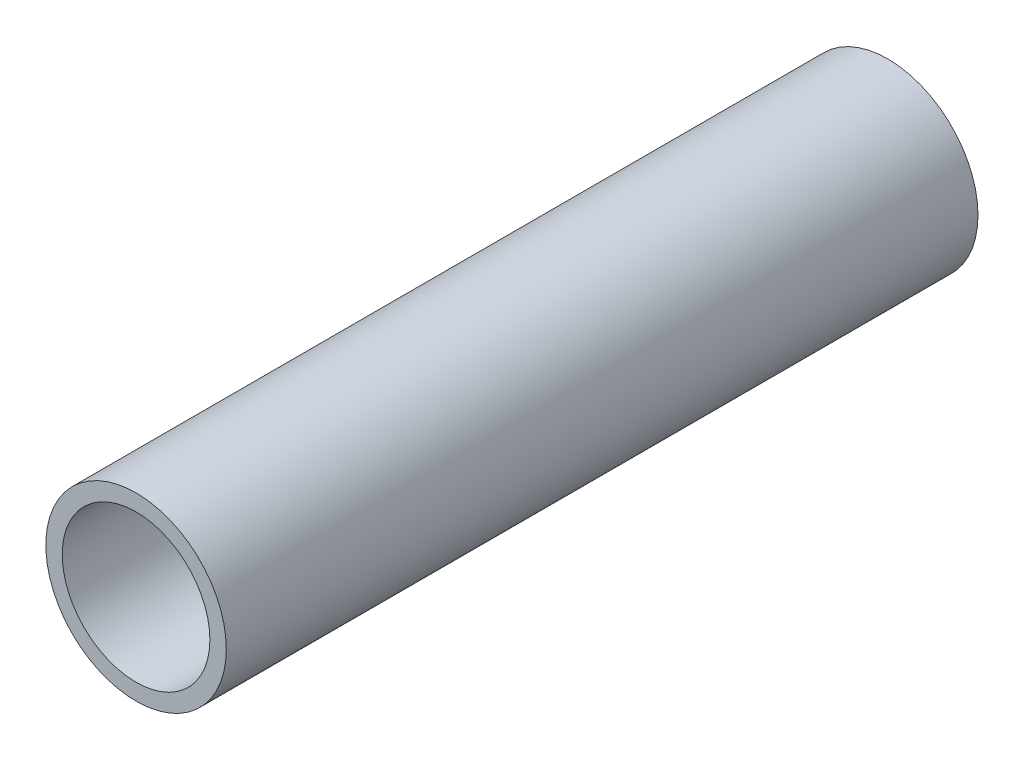
ISO-10303-21;
HEADER;
FILE_DESCRIPTION(('STEP AP214'),'2;1');
FILE_NAME('part.step','',(''),(''),'','','');
FILE_SCHEMA(('AUTOMOTIVE_DESIGN { 1 0 10303 214 1 1 1 1 }'));
ENDSEC;
DATA;
#1=APPLICATION_CONTEXT('core data for automotive mechanical design processes');
#2=APPLICATION_PROTOCOL_DEFINITION('international standard','automotive_design',2000,#1);
#3=PRODUCT_CONTEXT('',#1,'mechanical');
#4=PRODUCT('Part','Part','',(#3));
#5=PRODUCT_RELATED_PRODUCT_CATEGORY('part','',(#4));
#6=PRODUCT_DEFINITION_FORMATION('','',#4);
#7=PRODUCT_DEFINITION_CONTEXT('part definition',#1,'design');
#8=PRODUCT_DEFINITION('design','',#6,#7);
#9=PRODUCT_DEFINITION_SHAPE('','',#8);
#10=(LENGTH_UNIT() NAMED_UNIT(*) SI_UNIT(.MILLI.,.METRE.));
#11=(NAMED_UNIT(*) PLANE_ANGLE_UNIT() SI_UNIT($,.RADIAN.));
#12=(NAMED_UNIT(*) SI_UNIT($,.STERADIAN.) SOLID_ANGLE_UNIT());
#13=UNCERTAINTY_MEASURE_WITH_UNIT(LENGTH_MEASURE(1.E-05),#10,'distance_accuracy_value','');
#14=(GEOMETRIC_REPRESENTATION_CONTEXT(3) GLOBAL_UNCERTAINTY_ASSIGNED_CONTEXT((#13)) GLOBAL_UNIT_ASSIGNED_CONTEXT((#10,
#11,#12)) REPRESENTATION_CONTEXT('',''));
#15=CARTESIAN_POINT('',(0.,0.,0.));
#16=DIRECTION('',(0.,0.,1.));
#17=DIRECTION('',(1.,0.,0.));
#18=AXIS2_PLACEMENT_3D('',#15,#16,#17);
#19=CARTESIAN_POINT('',(0.,0.,44.45));
#20=DIRECTION('',(0.,0.,1.));
#21=DIRECTION('',(1.,0.,0.));
#22=AXIS2_PLACEMENT_3D('',#19,#20,#21);
#23=PLANE('',#22);
#24=CARTESIAN_POINT('',(0.,0.,44.45));
#25=DIRECTION('',(0.,0.,1.));
#26=DIRECTION('',(1.,0.,0.));
#27=AXIS2_PLACEMENT_3D('',#24,#25,#26);
#28=CIRCLE('',#27,5.335);
#29=CARTESIAN_POINT('',(5.335,0.,44.45));
#30=VERTEX_POINT('',#29);
#31=EDGE_CURVE('E10',#30,#30,#28,.T.);
#32=ORIENTED_EDGE('',*,*,#31,.T.);
#33=EDGE_LOOP('',(#32));
#34=FACE_BOUND('',#33,.T.);
#35=CARTESIAN_POINT('',(0.,0.,44.45));
#36=DIRECTION('',(0.,0.,1.));
#37=DIRECTION('',(1.,0.,0.));
#38=AXIS2_PLACEMENT_3D('',#35,#36,#37);
#39=CIRCLE('',#38,4.365);
#40=CARTESIAN_POINT('',(4.365,0.,44.45));
#41=VERTEX_POINT('',#40);
#42=EDGE_CURVE('E41',#41,#41,#39,.T.);
#43=ORIENTED_EDGE('',*,*,#42,.F.);
#44=EDGE_LOOP('',(#43));
#45=FACE_BOUND('',#44,.T.);
#46=ADVANCED_FACE('F30',(#34,#45),#23,.T.);
#47=CARTESIAN_POINT('',(0.,0.,0.));
#48=DIRECTION('',(0.,0.,1.));
#49=DIRECTION('',(1.,0.,0.));
#50=AXIS2_PLACEMENT_3D('',#47,#48,#49);
#51=PLANE('',#50);
#52=CARTESIAN_POINT('',(0.,0.,0.));
#53=DIRECTION('',(0.,0.,1.));
#54=DIRECTION('',(1.,0.,0.));
#55=AXIS2_PLACEMENT_3D('',#52,#53,#54);
#56=CIRCLE('',#55,5.335);
#57=CARTESIAN_POINT('',(5.335,0.,0.));
#58=VERTEX_POINT('',#57);
#59=EDGE_CURVE('E34',#58,#58,#56,.T.);
#60=ORIENTED_EDGE('',*,*,#59,.F.);
#61=EDGE_LOOP('',(#60));
#62=FACE_BOUND('',#61,.T.);
#63=CARTESIAN_POINT('',(0.,0.,0.));
#64=DIRECTION('',(0.,0.,1.));
#65=DIRECTION('',(1.,0.,0.));
#66=AXIS2_PLACEMENT_3D('',#63,#64,#65);
#67=CIRCLE('',#66,4.365);
#68=CARTESIAN_POINT('',(4.365,0.,0.));
#69=VERTEX_POINT('',#68);
#70=EDGE_CURVE('E43',#69,#69,#67,.T.);
#71=ORIENTED_EDGE('',*,*,#70,.T.);
#72=EDGE_LOOP('',(#71));
#73=FACE_BOUND('',#72,.T.);
#74=ADVANCED_FACE('F53',(#62,#73),#51,.F.);
#75=CARTESIAN_POINT('',(0.,0.,44.45));
#76=DIRECTION('',(0.,0.,-1.));
#77=DIRECTION('',(-1.,0.,0.));
#78=AXIS2_PLACEMENT_3D('',#75,#76,#77);
#79=CYLINDRICAL_SURFACE('',#78,5.335);
#80=ORIENTED_EDGE('',*,*,#31,.F.);
#81=EDGE_LOOP('',(#80));
#82=FACE_BOUND('',#81,.T.);
#83=ORIENTED_EDGE('',*,*,#59,.T.);
#84=EDGE_LOOP('',(#83));
#85=FACE_BOUND('',#84,.T.);
#86=ADVANCED_FACE('F32',(#82,#85),#79,.T.);
#87=CARTESIAN_POINT('',(0.,0.,44.45));
#88=DIRECTION('',(0.,0.,-1.));
#89=DIRECTION('',(-1.,0.,0.));
#90=AXIS2_PLACEMENT_3D('',#87,#88,#89);
#91=CYLINDRICAL_SURFACE('',#90,4.365);
#92=ORIENTED_EDGE('',*,*,#42,.T.);
#93=EDGE_LOOP('',(#92));
#94=FACE_BOUND('',#93,.T.);
#95=ORIENTED_EDGE('',*,*,#70,.F.);
#96=EDGE_LOOP('',(#95));
#97=FACE_BOUND('',#96,.T.);
#98=ADVANCED_FACE('F49',(#94,#97),#91,.F.);
#99=CLOSED_SHELL('',(#46,#74,#86,#98));
#100=MANIFOLD_SOLID_BREP('B2',#99);
#101=ADVANCED_BREP_SHAPE_REPRESENTATION('',(#18,#100),#14);
#102=SHAPE_DEFINITION_REPRESENTATION(#9,#101);
ENDSEC;
END-ISO-10303-21;
